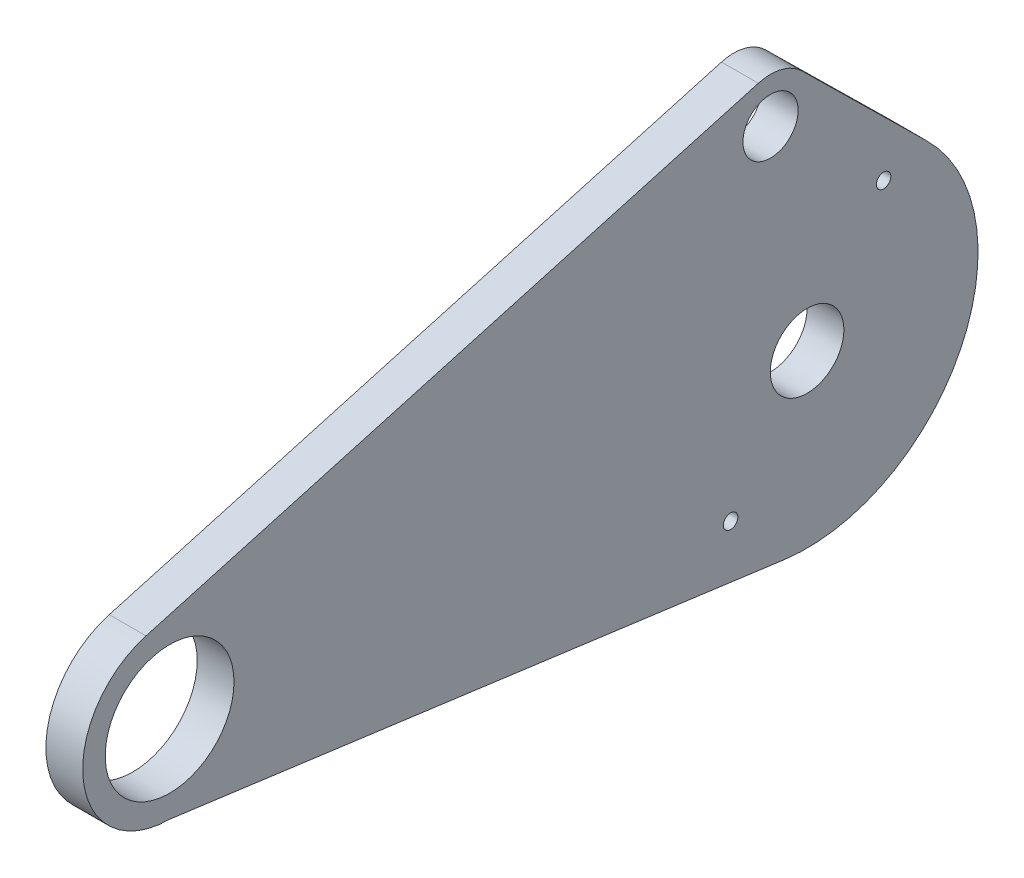
ISO-10303-21;
HEADER;
FILE_DESCRIPTION(('STEP AP214'),'2;1');
FILE_NAME('part.step','',(''),(''),'','','');
FILE_SCHEMA(('AUTOMOTIVE_DESIGN { 1 0 10303 214 1 1 1 1 }'));
ENDSEC;
DATA;
#1=APPLICATION_CONTEXT('core data for automotive mechanical design processes');
#2=APPLICATION_PROTOCOL_DEFINITION('international standard','automotive_design',2000,#1);
#3=PRODUCT_CONTEXT('',#1,'mechanical');
#4=PRODUCT('Part','Part','',(#3));
#5=PRODUCT_RELATED_PRODUCT_CATEGORY('part','',(#4));
#6=PRODUCT_DEFINITION_FORMATION('','',#4);
#7=PRODUCT_DEFINITION_CONTEXT('part definition',#1,'design');
#8=PRODUCT_DEFINITION('design','',#6,#7);
#9=PRODUCT_DEFINITION_SHAPE('','',#8);
#10=(LENGTH_UNIT() NAMED_UNIT(*) SI_UNIT(.MILLI.,.METRE.));
#11=(NAMED_UNIT(*) PLANE_ANGLE_UNIT() SI_UNIT($,.RADIAN.));
#12=(NAMED_UNIT(*) SI_UNIT($,.STERADIAN.) SOLID_ANGLE_UNIT());
#13=UNCERTAINTY_MEASURE_WITH_UNIT(LENGTH_MEASURE(1.E-05),#10,'distance_accuracy_value','');
#14=(GEOMETRIC_REPRESENTATION_CONTEXT(3) GLOBAL_UNCERTAINTY_ASSIGNED_CONTEXT((#13)) GLOBAL_UNIT_ASSIGNED_CONTEXT((#10,
#11,#12)) REPRESENTATION_CONTEXT('',''));
#15=CARTESIAN_POINT('',(0.,0.,0.));
#16=DIRECTION('',(0.,0.,1.));
#17=DIRECTION('',(1.,0.,0.));
#18=AXIS2_PLACEMENT_3D('',#15,#16,#17);
#19=CARTESIAN_POINT('',(3.175,76.0123351356269,-74.856908860509));
#20=DIRECTION('',(0.,-0.712501236629893,0.701670854319084));
#21=DIRECTION('',(0.,-0.701670854319084,-0.712501236629893));
#22=AXIS2_PLACEMENT_3D('',#19,#20,#21);
#23=PLANE('',#22);
#24=DIRECTION('',(0.,0.701670854319084,0.712501236629893));
#25=VECTOR('',#24,1.);
#26=CARTESIAN_POINT('',(-3.175,76.0123351356269,-74.856908860509));
#27=LINE('',#26,#25);
#28=CARTESIAN_POINT('',(-3.175,21.0187864805818,-130.699290202413));
#29=VERTEX_POINT('',#28);
#30=CARTESIAN_POINT('',(-3.175,42.2549102388364,-109.135384069152));
#31=VERTEX_POINT('',#30);
#32=EDGE_CURVE('E132',#29,#31,#27,.T.);
#33=ORIENTED_EDGE('',*,*,#32,.T.);
#34=DIRECTION('',(-1.,0.,0.));
#35=VECTOR('',#34,1.);
#36=CARTESIAN_POINT('',(3.175,42.2549102388364,-109.135384069152));
#37=LINE('',#36,#35);
#38=CARTESIAN_POINT('',(3.175,42.2549102388364,-109.135384069152));
#39=VERTEX_POINT('',#38);
#40=EDGE_CURVE('E11',#39,#31,#37,.T.);
#41=ORIENTED_EDGE('',*,*,#40,.F.);
#42=DIRECTION('',(0.,0.701670854319084,0.712501236629893));
#43=VECTOR('',#42,1.);
#44=CARTESIAN_POINT('',(3.175,76.0123351356269,-74.856908860509));
#45=LINE('',#44,#43);
#46=CARTESIAN_POINT('',(3.175,21.0187864805818,-130.699290202413));
#47=VERTEX_POINT('',#46);
#48=EDGE_CURVE('E154',#47,#39,#45,.T.);
#49=ORIENTED_EDGE('',*,*,#48,.F.);
#50=DIRECTION('',(-1.,0.,0.));
#51=VECTOR('',#50,1.);
#52=CARTESIAN_POINT('',(3.175,21.0187864805818,-130.699290202413));
#53=LINE('',#52,#51);
#54=EDGE_CURVE('E131',#47,#29,#53,.T.);
#55=ORIENTED_EDGE('',*,*,#54,.T.);
#56=EDGE_LOOP('',(#33,#41,#49,#55));
#57=FACE_BOUND('',#56,.T.);
#58=ADVANCED_FACE('F39',(#57),#23,.F.);
#59=CARTESIAN_POINT('',(3.175,36.7241193894969,-103.6886640625));
#60=DIRECTION('',(-1.,0.,0.));
#61=DIRECTION('',(0.,0.,1.));
#62=AXIS2_PLACEMENT_3D('',#59,#60,#61);
#63=CYLINDRICAL_SURFACE('',#62,7.76249999999999);
#64=CARTESIAN_POINT('',(-3.175,36.7241193894969,-103.6886640625));
#65=DIRECTION('',(1.,0.,0.));
#66=DIRECTION('',(0.,0.,-1.));
#67=AXIS2_PLACEMENT_3D('',#64,#65,#66);
#68=CIRCLE('',#67,7.76249999999999);
#69=CARTESIAN_POINT('',(-3.175,44.1958971444441,-101.5841585551));
#70=VERTEX_POINT('',#69);
#71=EDGE_CURVE('E135',#31,#70,#68,.T.);
#72=ORIENTED_EDGE('',*,*,#71,.T.);
#73=DIRECTION('',(-1.,0.,0.));
#74=VECTOR('',#73,1.);
#75=CARTESIAN_POINT('',(3.175,44.1958971444441,-101.5841585551));
#76=LINE('',#75,#74);
#77=CARTESIAN_POINT('',(3.175,44.1958971444441,-101.5841585551));
#78=VERTEX_POINT('',#77);
#79=EDGE_CURVE('E47',#78,#70,#76,.T.);
#80=ORIENTED_EDGE('',*,*,#79,.F.);
#81=CARTESIAN_POINT('',(3.175,36.7241193894969,-103.6886640625));
#82=DIRECTION('',(1.,0.,0.));
#83=DIRECTION('',(0.,0.,-1.));
#84=AXIS2_PLACEMENT_3D('',#81,#82,#83);
#85=CIRCLE('',#84,7.76249999999999);
#86=EDGE_CURVE('E92',#39,#78,#85,.T.);
#87=ORIENTED_EDGE('',*,*,#86,.F.);
#88=ORIENTED_EDGE('',*,*,#40,.T.);
#89=EDGE_LOOP('',(#72,#80,#87,#88));
#90=FACE_BOUND('',#89,.T.);
#91=ADVANCED_FACE('F160',(#90),#63,.T.);
#92=CARTESIAN_POINT('',(3.175,14.4382178839559,4.06667730898528));
#93=DIRECTION('',(0.,0.962547858930394,0.271111820599018));
#94=DIRECTION('',(0.,-0.271111820599018,0.962547858930394));
#95=AXIS2_PLACEMENT_3D('',#92,#93,#94);
#96=PLANE('',#95);
#97=DIRECTION('',(0.,0.271111820599018,-0.962547858930394));
#98=VECTOR('',#97,1.);
#99=CARTESIAN_POINT('',(-3.175,14.4382178839559,4.06667730898528));
#100=LINE('',#99,#98);
#101=CARTESIAN_POINT('',(-3.175,14.4382178839559,4.06667730898528));
#102=VERTEX_POINT('',#101);
#103=EDGE_CURVE('E139',#102,#70,#100,.T.);
#104=ORIENTED_EDGE('',*,*,#103,.F.);
#105=DIRECTION('',(-1.,0.,0.));
#106=VECTOR('',#105,1.);
#107=CARTESIAN_POINT('',(3.175,14.4382178839559,4.06667730898528));
#108=LINE('',#107,#106);
#109=CARTESIAN_POINT('',(3.175,14.4382178839559,4.06667730898528));
#110=VERTEX_POINT('',#109);
#111=EDGE_CURVE('E114',#110,#102,#108,.T.);
#112=ORIENTED_EDGE('',*,*,#111,.F.);
#113=DIRECTION('',(0.,0.271111820599018,-0.962547858930394));
#114=VECTOR('',#113,1.);
#115=CARTESIAN_POINT('',(3.175,14.4382178839559,4.06667730898528));
#116=LINE('',#115,#114);
#117=EDGE_CURVE('E107',#110,#78,#116,.T.);
#118=ORIENTED_EDGE('',*,*,#117,.T.);
#119=ORIENTED_EDGE('',*,*,#79,.T.);
#120=EDGE_LOOP('',(#104,#112,#118,#119));
#121=FACE_BOUND('',#120,.T.);
#122=ADVANCED_FACE('F159',(#121),#96,.T.);
#123=CARTESIAN_POINT('',(3.175,0.,0.));
#124=DIRECTION('',(-1.,0.,0.));
#125=DIRECTION('',(0.,0.,1.));
#126=AXIS2_PLACEMENT_3D('',#123,#124,#125);
#127=CYLINDRICAL_SURFACE('',#126,15.);
#128=CARTESIAN_POINT('',(-3.175,0.,0.));
#129=DIRECTION('',(1.,0.,0.));
#130=DIRECTION('',(0.,0.,-1.));
#131=AXIS2_PLACEMENT_3D('',#128,#129,#130);
#132=CIRCLE('',#131,15.);
#133=CARTESIAN_POINT('',(-3.175,-15.,0.));
#134=VERTEX_POINT('',#133);
#135=EDGE_CURVE('E113',#102,#134,#132,.T.);
#136=ORIENTED_EDGE('',*,*,#135,.T.);
#137=DIRECTION('',(-1.,0.,0.));
#138=VECTOR('',#137,1.);
#139=CARTESIAN_POINT('',(3.175,-15.,0.));
#140=LINE('',#139,#138);
#141=CARTESIAN_POINT('',(3.175,-15.,0.));
#142=VERTEX_POINT('',#141);
#143=EDGE_CURVE('E110',#142,#134,#140,.T.);
#144=ORIENTED_EDGE('',*,*,#143,.F.);
#145=CARTESIAN_POINT('',(3.175,0.,0.));
#146=DIRECTION('',(1.,0.,0.));
#147=DIRECTION('',(0.,0.,-1.));
#148=AXIS2_PLACEMENT_3D('',#145,#146,#147);
#149=CIRCLE('',#148,15.);
#150=EDGE_CURVE('E100',#110,#142,#149,.T.);
#151=ORIENTED_EDGE('',*,*,#150,.F.);
#152=ORIENTED_EDGE('',*,*,#111,.T.);
#153=EDGE_LOOP('',(#136,#144,#151,#152));
#154=FACE_BOUND('',#153,.T.);
#155=ADVANCED_FACE('F111',(#154),#127,.T.);
#156=CARTESIAN_POINT('',(3.175,-14.7345445536607,1.97771714385494));
#157=DIRECTION('',(0.,0.9911119867321,-0.133030183627441));
#158=DIRECTION('',(0.,0.133030183627441,0.9911119867321));
#159=AXIS2_PLACEMENT_3D('',#156,#157,#158);
#160=PLANE('',#159);
#161=DIRECTION('',(0.,-0.133030183627441,-0.9911119867321));
#162=VECTOR('',#161,1.);
#163=CARTESIAN_POINT('',(-3.175,-14.7345445536607,1.97771714385494));
#164=LINE('',#163,#162);
#165=CARTESIAN_POINT('',(-3.175,-29.2378036085969,-106.07560958299));
#166=VERTEX_POINT('',#165);
#167=EDGE_CURVE('E78',#134,#166,#164,.T.);
#168=ORIENTED_EDGE('',*,*,#167,.T.);
#169=DIRECTION('',(-1.,0.,0.));
#170=VECTOR('',#169,1.);
#171=CARTESIAN_POINT('',(3.175,-29.2378036085969,-106.07560958299));
#172=LINE('',#171,#170);
#173=CARTESIAN_POINT('',(3.175,-29.2378036085969,-106.07560958299));
#174=VERTEX_POINT('',#173);
#175=EDGE_CURVE('E115',#174,#166,#172,.T.);
#176=ORIENTED_EDGE('',*,*,#175,.F.);
#177=DIRECTION('',(0.,-0.133030183627441,-0.9911119867321));
#178=VECTOR('',#177,1.);
#179=CARTESIAN_POINT('',(3.175,-14.7345445536607,1.97771714385494));
#180=LINE('',#179,#178);
#181=EDGE_CURVE('E105',#142,#174,#180,.T.);
#182=ORIENTED_EDGE('',*,*,#181,.F.);
#183=ORIENTED_EDGE('',*,*,#143,.T.);
#184=EDGE_LOOP('',(#168,#176,#182,#183));
#185=FACE_BOUND('',#184,.T.);
#186=ADVANCED_FACE('F117',(#185),#160,.F.);
#187=CARTESIAN_POINT('',(3.175,0.,0.));
#188=DIRECTION('',(-1.,0.,0.));
#189=DIRECTION('',(0.,0.,1.));
#190=AXIS2_PLACEMENT_3D('',#187,#188,#189);
#191=CYLINDRICAL_SURFACE('',#190,11.1125);
#192=CARTESIAN_POINT('',(3.175,0.,0.));
#193=DIRECTION('',(1.,0.,0.));
#194=DIRECTION('',(0.,0.,-1.));
#195=AXIS2_PLACEMENT_3D('',#192,#193,#194);
#196=CIRCLE('',#195,11.1125);
#197=CARTESIAN_POINT('',(3.175,0.,-11.1125));
#198=VERTEX_POINT('',#197);
#199=EDGE_CURVE('E125',#198,#198,#196,.T.);
#200=ORIENTED_EDGE('',*,*,#199,.T.);
#201=EDGE_LOOP('',(#200));
#202=FACE_BOUND('',#201,.T.);
#203=CARTESIAN_POINT('',(-3.175,0.,0.));
#204=DIRECTION('',(1.,0.,0.));
#205=DIRECTION('',(0.,0.,-1.));
#206=AXIS2_PLACEMENT_3D('',#203,#204,#205);
#207=CIRCLE('',#206,11.1125);
#208=CARTESIAN_POINT('',(-3.175,0.,-11.1125));
#209=VERTEX_POINT('',#208);
#210=EDGE_CURVE('E148',#209,#209,#207,.T.);
#211=ORIENTED_EDGE('',*,*,#210,.F.);
#212=EDGE_LOOP('',(#211));
#213=FACE_BOUND('',#212,.T.);
#214=ADVANCED_FACE('F179',(#202,#213),#191,.F.);
#215=CARTESIAN_POINT('',(3.175,0.,-110.));
#216=DIRECTION('',(-1.,0.,0.));
#217=DIRECTION('',(0.,0.,1.));
#218=AXIS2_PLACEMENT_3D('',#215,#216,#217);
#219=CYLINDRICAL_SURFACE('',#218,6.35);
#220=CARTESIAN_POINT('',(3.175,0.,-110.));
#221=DIRECTION('',(1.,0.,0.));
#222=DIRECTION('',(0.,0.,-1.));
#223=AXIS2_PLACEMENT_3D('',#220,#221,#222);
#224=CIRCLE('',#223,6.35);
#225=CARTESIAN_POINT('',(3.175,0.,-116.35));
#226=VERTEX_POINT('',#225);
#227=EDGE_CURVE('E119',#226,#226,#224,.T.);
#228=ORIENTED_EDGE('',*,*,#227,.T.);
#229=EDGE_LOOP('',(#228));
#230=FACE_BOUND('',#229,.T.);
#231=CARTESIAN_POINT('',(-3.175,0.,-110.));
#232=DIRECTION('',(1.,0.,0.));
#233=DIRECTION('',(0.,0.,-1.));
#234=AXIS2_PLACEMENT_3D('',#231,#232,#233);
#235=CIRCLE('',#234,6.35);
#236=CARTESIAN_POINT('',(-3.175,0.,-116.35));
#237=VERTEX_POINT('',#236);
#238=EDGE_CURVE('E145',#237,#237,#235,.T.);
#239=ORIENTED_EDGE('',*,*,#238,.F.);
#240=EDGE_LOOP('',(#239));
#241=FACE_BOUND('',#240,.T.);
#242=ADVANCED_FACE('F171',(#230,#241),#219,.F.);
#243=CARTESIAN_POINT('',(3.175,0.,-110.));
#244=DIRECTION('',(-1.,0.,0.));
#245=DIRECTION('',(0.,0.,1.));
#246=AXIS2_PLACEMENT_3D('',#243,#244,#245);
#247=CYLINDRICAL_SURFACE('',#246,29.5);
#248=CARTESIAN_POINT('',(-3.175,0.,-110.));
#249=DIRECTION('',(1.,0.,0.));
#250=DIRECTION('',(0.,0.,-1.));
#251=AXIS2_PLACEMENT_3D('',#248,#249,#250);
#252=CIRCLE('',#251,29.5);
#253=EDGE_CURVE('E84',#166,#29,#252,.T.);
#254=ORIENTED_EDGE('',*,*,#253,.T.);
#255=ORIENTED_EDGE('',*,*,#54,.F.);
#256=CARTESIAN_POINT('',(3.175,0.,-110.));
#257=DIRECTION('',(1.,0.,0.));
#258=DIRECTION('',(0.,0.,-1.));
#259=AXIS2_PLACEMENT_3D('',#256,#257,#258);
#260=CIRCLE('',#259,29.5);
#261=EDGE_CURVE('E55',#174,#47,#260,.T.);
#262=ORIENTED_EDGE('',*,*,#261,.F.);
#263=ORIENTED_EDGE('',*,*,#175,.T.);
#264=EDGE_LOOP('',(#254,#255,#262,#263));
#265=FACE_BOUND('',#264,.T.);
#266=ADVANCED_FACE('F168',(#265),#247,.T.);
#267=CARTESIAN_POINT('',(3.175,36.7241193894969,-103.6886640625));
#268=DIRECTION('',(-1.,0.,0.));
#269=DIRECTION('',(0.,0.,1.));
#270=AXIS2_PLACEMENT_3D('',#267,#268,#269);
#271=CYLINDRICAL_SURFACE('',#270,4.7625);
#272=CARTESIAN_POINT('',(3.175,36.7241193894969,-103.6886640625));
#273=DIRECTION('',(1.,0.,0.));
#274=DIRECTION('',(0.,0.,-1.));
#275=AXIS2_PLACEMENT_3D('',#272,#273,#274);
#276=CIRCLE('',#275,4.7625);
#277=CARTESIAN_POINT('',(3.175,36.7241193894969,-108.4511640625));
#278=VERTEX_POINT('',#277);
#279=EDGE_CURVE('E128',#278,#278,#276,.T.);
#280=ORIENTED_EDGE('',*,*,#279,.T.);
#281=EDGE_LOOP('',(#280));
#282=FACE_BOUND('',#281,.T.);
#283=CARTESIAN_POINT('',(-3.175,36.7241193894969,-103.6886640625));
#284=DIRECTION('',(1.,0.,0.));
#285=DIRECTION('',(0.,0.,-1.));
#286=AXIS2_PLACEMENT_3D('',#283,#284,#285);
#287=CIRCLE('',#286,4.7625);
#288=CARTESIAN_POINT('',(-3.175,36.7241193894969,-108.4511640625));
#289=VERTEX_POINT('',#288);
#290=EDGE_CURVE('E151',#289,#289,#287,.T.);
#291=ORIENTED_EDGE('',*,*,#290,.F.);
#292=EDGE_LOOP('',(#291));
#293=FACE_BOUND('',#292,.T.);
#294=ADVANCED_FACE('F170',(#282,#293),#271,.F.);
#295=CARTESIAN_POINT('',(3.175,0.,0.));
#296=DIRECTION('',(1.,0.,0.));
#297=DIRECTION('',(0.,0.,-1.));
#298=AXIS2_PLACEMENT_3D('',#295,#296,#297);
#299=PLANE('',#298);
#300=CARTESIAN_POINT('',(3.175,18.8527842993112,-123.200861682619));
#301=DIRECTION('',(1.,0.,0.));
#302=DIRECTION('',(0.,0.,-1.));
#303=AXIS2_PLACEMENT_3D('',#300,#301,#302);
#304=CIRCLE('',#303,1.25);
#305=CARTESIAN_POINT('',(3.175,18.8527842993112,-124.450861682619));
#306=VERTEX_POINT('',#305);
#307=EDGE_CURVE('E224',#306,#306,#304,.T.);
#308=ORIENTED_EDGE('',*,*,#307,.F.);
#309=EDGE_LOOP('',(#308));
#310=FACE_BOUND('',#309,.T.);
#311=CARTESIAN_POINT('',(3.175,-18.8527842993112,-96.7991383173807));
#312=DIRECTION('',(1.,0.,0.));
#313=DIRECTION('',(0.,0.,-1.));
#314=AXIS2_PLACEMENT_3D('',#311,#312,#313);
#315=CIRCLE('',#314,1.25);
#316=CARTESIAN_POINT('',(3.175,-18.8527842993112,-98.0491383173807));
#317=VERTEX_POINT('',#316);
#318=EDGE_CURVE('E226',#317,#317,#315,.T.);
#319=ORIENTED_EDGE('',*,*,#318,.F.);
#320=EDGE_LOOP('',(#319));
#321=FACE_BOUND('',#320,.T.);
#322=ORIENTED_EDGE('',*,*,#48,.T.);
#323=ORIENTED_EDGE('',*,*,#86,.T.);
#324=ORIENTED_EDGE('',*,*,#117,.F.);
#325=ORIENTED_EDGE('',*,*,#150,.T.);
#326=ORIENTED_EDGE('',*,*,#181,.T.);
#327=ORIENTED_EDGE('',*,*,#261,.T.);
#328=EDGE_LOOP('',(#322,#323,#324,#325,#326,#327));
#329=FACE_BOUND('',#328,.T.);
#330=ORIENTED_EDGE('',*,*,#227,.F.);
#331=EDGE_LOOP('',(#330));
#332=FACE_BOUND('',#331,.T.);
#333=ORIENTED_EDGE('',*,*,#199,.F.);
#334=EDGE_LOOP('',(#333));
#335=FACE_BOUND('',#334,.T.);
#336=ORIENTED_EDGE('',*,*,#279,.F.);
#337=EDGE_LOOP('',(#336));
#338=FACE_BOUND('',#337,.T.);
#339=ADVANCED_FACE('F102',(#310,#321,#329,#332,#335,#338),#299,.T.);
#340=CARTESIAN_POINT('',(-3.175,0.,0.));
#341=DIRECTION('',(1.,0.,0.));
#342=DIRECTION('',(0.,0.,-1.));
#343=AXIS2_PLACEMENT_3D('',#340,#341,#342);
#344=PLANE('',#343);
#345=CARTESIAN_POINT('',(-3.175,18.8527842993112,-123.200861682619));
#346=DIRECTION('',(1.,0.,0.));
#347=DIRECTION('',(0.,0.,-1.));
#348=AXIS2_PLACEMENT_3D('',#345,#346,#347);
#349=CIRCLE('',#348,1.25);
#350=CARTESIAN_POINT('',(-3.175,18.8527842993112,-124.450861682619));
#351=VERTEX_POINT('',#350);
#352=EDGE_CURVE('E221',#351,#351,#349,.T.);
#353=ORIENTED_EDGE('',*,*,#352,.T.);
#354=EDGE_LOOP('',(#353));
#355=FACE_BOUND('',#354,.T.);
#356=CARTESIAN_POINT('',(-3.175,-18.8527842993112,-96.7991383173807));
#357=DIRECTION('',(1.,0.,0.));
#358=DIRECTION('',(0.,0.,-1.));
#359=AXIS2_PLACEMENT_3D('',#356,#357,#358);
#360=CIRCLE('',#359,1.25);
#361=CARTESIAN_POINT('',(-3.175,-18.8527842993112,-98.0491383173807));
#362=VERTEX_POINT('',#361);
#363=EDGE_CURVE('E136',#362,#362,#360,.T.);
#364=ORIENTED_EDGE('',*,*,#363,.T.);
#365=EDGE_LOOP('',(#364));
#366=FACE_BOUND('',#365,.T.);
#367=ORIENTED_EDGE('',*,*,#32,.F.);
#368=ORIENTED_EDGE('',*,*,#253,.F.);
#369=ORIENTED_EDGE('',*,*,#167,.F.);
#370=ORIENTED_EDGE('',*,*,#135,.F.);
#371=ORIENTED_EDGE('',*,*,#103,.T.);
#372=ORIENTED_EDGE('',*,*,#71,.F.);
#373=EDGE_LOOP('',(#367,#368,#369,#370,#371,#372));
#374=FACE_BOUND('',#373,.T.);
#375=ORIENTED_EDGE('',*,*,#238,.T.);
#376=EDGE_LOOP('',(#375));
#377=FACE_BOUND('',#376,.T.);
#378=ORIENTED_EDGE('',*,*,#210,.T.);
#379=EDGE_LOOP('',(#378));
#380=FACE_BOUND('',#379,.T.);
#381=ORIENTED_EDGE('',*,*,#290,.T.);
#382=EDGE_LOOP('',(#381));
#383=FACE_BOUND('',#382,.T.);
#384=ADVANCED_FACE('F164',(#355,#366,#374,#377,#380,#383),#344,.F.);
#385=CARTESIAN_POINT('',(3.175,-18.8527842993112,-96.7991383173807));
#386=DIRECTION('',(1.,0.,0.));
#387=DIRECTION('',(0.,0.,-1.));
#388=AXIS2_PLACEMENT_3D('',#385,#386,#387);
#389=CYLINDRICAL_SURFACE('',#388,1.25);
#390=ORIENTED_EDGE('',*,*,#363,.F.);
#391=EDGE_LOOP('',(#390));
#392=FACE_BOUND('',#391,.T.);
#393=ORIENTED_EDGE('',*,*,#318,.T.);
#394=EDGE_LOOP('',(#393));
#395=FACE_BOUND('',#394,.T.);
#396=ADVANCED_FACE('F205',(#392,#395),#389,.F.);
#397=CARTESIAN_POINT('',(3.175,18.8527842993112,-123.200861682619));
#398=DIRECTION('',(1.,0.,0.));
#399=DIRECTION('',(0.,0.,-1.));
#400=AXIS2_PLACEMENT_3D('',#397,#398,#399);
#401=CYLINDRICAL_SURFACE('',#400,1.25);
#402=ORIENTED_EDGE('',*,*,#352,.F.);
#403=EDGE_LOOP('',(#402));
#404=FACE_BOUND('',#403,.T.);
#405=ORIENTED_EDGE('',*,*,#307,.T.);
#406=EDGE_LOOP('',(#405));
#407=FACE_BOUND('',#406,.T.);
#408=ADVANCED_FACE('F212',(#404,#407),#401,.F.);
#409=CLOSED_SHELL('',(#58,#91,#122,#155,#186,#214,#242,#266,#294,#339,#384,#396,#408));
#410=MANIFOLD_SOLID_BREP('B2',#409);
#411=ADVANCED_BREP_SHAPE_REPRESENTATION('',(#18,#410),#14);
#412=SHAPE_DEFINITION_REPRESENTATION(#9,#411);
ENDSEC;
END-ISO-10303-21;
